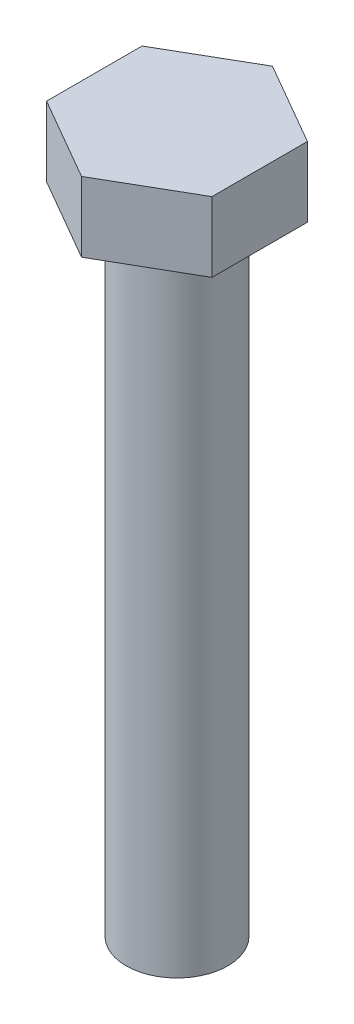
ISO-10303-21;
HEADER;
FILE_DESCRIPTION(('STEP AP214'),'2;1');
FILE_NAME('part.step','',(''),(''),'','','');
FILE_SCHEMA(('AUTOMOTIVE_DESIGN { 1 0 10303 214 1 1 1 1 }'));
ENDSEC;
DATA;
#1=APPLICATION_CONTEXT('core data for automotive mechanical design processes');
#2=APPLICATION_PROTOCOL_DEFINITION('international standard','automotive_design',2000,#1);
#3=PRODUCT_CONTEXT('',#1,'mechanical');
#4=PRODUCT('Part','Part','',(#3));
#5=PRODUCT_RELATED_PRODUCT_CATEGORY('part','',(#4));
#6=PRODUCT_DEFINITION_FORMATION('','',#4);
#7=PRODUCT_DEFINITION_CONTEXT('part definition',#1,'design');
#8=PRODUCT_DEFINITION('design','',#6,#7);
#9=PRODUCT_DEFINITION_SHAPE('','',#8);
#10=(LENGTH_UNIT() NAMED_UNIT(*) SI_UNIT(.MILLI.,.METRE.));
#11=(NAMED_UNIT(*) PLANE_ANGLE_UNIT() SI_UNIT($,.RADIAN.));
#12=(NAMED_UNIT(*) SI_UNIT($,.STERADIAN.) SOLID_ANGLE_UNIT());
#13=UNCERTAINTY_MEASURE_WITH_UNIT(LENGTH_MEASURE(1.E-05),#10,'distance_accuracy_value','');
#14=(GEOMETRIC_REPRESENTATION_CONTEXT(3) GLOBAL_UNCERTAINTY_ASSIGNED_CONTEXT((#13)) GLOBAL_UNIT_ASSIGNED_CONTEXT((#10,
#11,#12)) REPRESENTATION_CONTEXT('',''));
#15=CARTESIAN_POINT('',(0.,0.,0.));
#16=DIRECTION('',(0.,0.,1.));
#17=DIRECTION('',(1.,0.,0.));
#18=AXIS2_PLACEMENT_3D('',#15,#16,#17);
#19=CARTESIAN_POINT('',(6.5,5.5,3.75277674973257));
#20=DIRECTION('',(-1.,0.,0.));
#21=DIRECTION('',(0.,0.,1.));
#22=AXIS2_PLACEMENT_3D('',#19,#20,#21);
#23=PLANE('',#22);
#24=DIRECTION('',(0.,0.,-1.));
#25=VECTOR('',#24,1.);
#26=CARTESIAN_POINT('',(6.5,0.,3.75277674973257));
#27=LINE('',#26,#25);
#28=CARTESIAN_POINT('',(6.5,0.,3.75277674973257));
#29=VERTEX_POINT('',#28);
#30=CARTESIAN_POINT('',(6.5,0.,-3.75277674973257));
#31=VERTEX_POINT('',#30);
#32=EDGE_CURVE('E117',#29,#31,#27,.T.);
#33=ORIENTED_EDGE('',*,*,#32,.T.);
#34=DIRECTION('',(0.,-1.,0.));
#35=VECTOR('',#34,1.);
#36=CARTESIAN_POINT('',(6.5,5.5,-3.75277674973257));
#37=LINE('',#36,#35);
#38=CARTESIAN_POINT('',(6.5,5.5,-3.75277674973257));
#39=VERTEX_POINT('',#38);
#40=EDGE_CURVE('E11',#39,#31,#37,.T.);
#41=ORIENTED_EDGE('',*,*,#40,.F.);
#42=DIRECTION('',(0.,0.,-1.));
#43=VECTOR('',#42,1.);
#44=CARTESIAN_POINT('',(6.5,5.5,3.75277674973257));
#45=LINE('',#44,#43);
#46=CARTESIAN_POINT('',(6.5,5.5,3.75277674973257));
#47=VERTEX_POINT('',#46);
#48=EDGE_CURVE('E128',#47,#39,#45,.T.);
#49=ORIENTED_EDGE('',*,*,#48,.F.);
#50=DIRECTION('',(0.,-1.,0.));
#51=VECTOR('',#50,1.);
#52=CARTESIAN_POINT('',(6.5,5.5,3.75277674973257));
#53=LINE('',#52,#51);
#54=EDGE_CURVE('E113',#47,#29,#53,.T.);
#55=ORIENTED_EDGE('',*,*,#54,.T.);
#56=EDGE_LOOP('',(#33,#41,#49,#55));
#57=FACE_BOUND('',#56,.T.);
#58=ADVANCED_FACE('F33',(#57),#23,.F.);
#59=CARTESIAN_POINT('',(6.5,5.5,-3.75277674973257));
#60=DIRECTION('',(-0.5,0.,0.866025403784438));
#61=DIRECTION('',(0.866025403784439,0.,0.5));
#62=AXIS2_PLACEMENT_3D('',#59,#60,#61);
#63=PLANE('',#62);
#64=DIRECTION('',(-0.866025403784439,0.,-0.5));
#65=VECTOR('',#64,1.);
#66=CARTESIAN_POINT('',(6.5,0.,-3.75277674973257));
#67=LINE('',#66,#65);
#68=CARTESIAN_POINT('',(0.,0.,-7.50555349946514));
#69=VERTEX_POINT('',#68);
#70=EDGE_CURVE('E120',#31,#69,#67,.T.);
#71=ORIENTED_EDGE('',*,*,#70,.T.);
#72=DIRECTION('',(0.,-1.,0.));
#73=VECTOR('',#72,1.);
#74=CARTESIAN_POINT('',(0.,5.5,-7.50555349946514));
#75=LINE('',#74,#73);
#76=CARTESIAN_POINT('',(0.,5.5,-7.50555349946514));
#77=VERTEX_POINT('',#76);
#78=EDGE_CURVE('E41',#77,#69,#75,.T.);
#79=ORIENTED_EDGE('',*,*,#78,.F.);
#80=DIRECTION('',(-0.866025403784439,0.,-0.5));
#81=VECTOR('',#80,1.);
#82=CARTESIAN_POINT('',(6.5,5.5,-3.75277674973257));
#83=LINE('',#82,#81);
#84=EDGE_CURVE('E86',#39,#77,#83,.T.);
#85=ORIENTED_EDGE('',*,*,#84,.F.);
#86=ORIENTED_EDGE('',*,*,#40,.T.);
#87=EDGE_LOOP('',(#71,#79,#85,#86));
#88=FACE_BOUND('',#87,.T.);
#89=ADVANCED_FACE('F152',(#88),#63,.F.);
#90=CARTESIAN_POINT('',(0.,5.5,-7.50555349946514));
#91=DIRECTION('',(0.500000000000001,0.,0.866025403784438));
#92=DIRECTION('',(0.866025403784438,0.,-0.500000000000001));
#93=AXIS2_PLACEMENT_3D('',#90,#91,#92);
#94=PLANE('',#93);
#95=DIRECTION('',(-0.866025403784438,0.,0.5));
#96=VECTOR('',#95,1.);
#97=CARTESIAN_POINT('',(0.,0.,-7.50555349946514));
#98=LINE('',#97,#96);
#99=CARTESIAN_POINT('',(-6.5,0.,-3.75277674973257));
#100=VERTEX_POINT('',#99);
#101=EDGE_CURVE('E123',#69,#100,#98,.T.);
#102=ORIENTED_EDGE('',*,*,#101,.T.);
#103=DIRECTION('',(0.,-1.,0.));
#104=VECTOR('',#103,1.);
#105=CARTESIAN_POINT('',(-6.5,5.5,-3.75277674973257));
#106=LINE('',#105,#104);
#107=CARTESIAN_POINT('',(-6.5,5.5,-3.75277674973257));
#108=VERTEX_POINT('',#107);
#109=EDGE_CURVE('E108',#108,#100,#106,.T.);
#110=ORIENTED_EDGE('',*,*,#109,.F.);
#111=DIRECTION('',(-0.866025403784438,0.,0.5));
#112=VECTOR('',#111,1.);
#113=CARTESIAN_POINT('',(0.,5.5,-7.50555349946514));
#114=LINE('',#113,#112);
#115=EDGE_CURVE('E99',#77,#108,#114,.T.);
#116=ORIENTED_EDGE('',*,*,#115,.F.);
#117=ORIENTED_EDGE('',*,*,#78,.T.);
#118=EDGE_LOOP('',(#102,#110,#116,#117));
#119=FACE_BOUND('',#118,.T.);
#120=ADVANCED_FACE('F134',(#119),#94,.F.);
#121=CARTESIAN_POINT('',(-6.5,5.5,-3.75277674973257));
#122=DIRECTION('',(1.,0.,0.));
#123=DIRECTION('',(0.,0.,-1.));
#124=AXIS2_PLACEMENT_3D('',#121,#122,#123);
#125=PLANE('',#124);
#126=DIRECTION('',(0.,0.,1.));
#127=VECTOR('',#126,1.);
#128=CARTESIAN_POINT('',(-6.5,0.,-3.75277674973257));
#129=LINE('',#128,#127);
#130=CARTESIAN_POINT('',(-6.5,0.,3.75277674973257));
#131=VERTEX_POINT('',#130);
#132=EDGE_CURVE('E107',#100,#131,#129,.T.);
#133=ORIENTED_EDGE('',*,*,#132,.T.);
#134=DIRECTION('',(0.,-1.,0.));
#135=VECTOR('',#134,1.);
#136=CARTESIAN_POINT('',(-6.5,5.5,3.75277674973257));
#137=LINE('',#136,#135);
#138=CARTESIAN_POINT('',(-6.5,5.5,3.75277674973257));
#139=VERTEX_POINT('',#138);
#140=EDGE_CURVE('E104',#139,#131,#137,.T.);
#141=ORIENTED_EDGE('',*,*,#140,.F.);
#142=DIRECTION('',(0.,0.,1.));
#143=VECTOR('',#142,1.);
#144=CARTESIAN_POINT('',(-6.5,5.5,-3.75277674973257));
#145=LINE('',#144,#143);
#146=EDGE_CURVE('E93',#108,#139,#145,.T.);
#147=ORIENTED_EDGE('',*,*,#146,.F.);
#148=ORIENTED_EDGE('',*,*,#109,.T.);
#149=EDGE_LOOP('',(#133,#141,#147,#148));
#150=FACE_BOUND('',#149,.T.);
#151=ADVANCED_FACE('F105',(#150),#125,.F.);
#152=CARTESIAN_POINT('',(-6.5,5.5,3.75277674973257));
#153=DIRECTION('',(0.5,0.,-0.866025403784438));
#154=DIRECTION('',(-0.866025403784439,0.,-0.5));
#155=AXIS2_PLACEMENT_3D('',#152,#153,#154);
#156=PLANE('',#155);
#157=DIRECTION('',(0.866025403784439,0.,0.5));
#158=VECTOR('',#157,1.);
#159=CARTESIAN_POINT('',(-6.5,0.,3.75277674973257));
#160=LINE('',#159,#158);
#161=CARTESIAN_POINT('',(0.,0.,7.50555349946514));
#162=VERTEX_POINT('',#161);
#163=EDGE_CURVE('E72',#131,#162,#160,.T.);
#164=ORIENTED_EDGE('',*,*,#163,.T.);
#165=DIRECTION('',(0.,-1.,0.));
#166=VECTOR('',#165,1.);
#167=CARTESIAN_POINT('',(0.,5.5,7.50555349946514));
#168=LINE('',#167,#166);
#169=CARTESIAN_POINT('',(0.,5.5,7.50555349946514));
#170=VERTEX_POINT('',#169);
#171=EDGE_CURVE('E109',#170,#162,#168,.T.);
#172=ORIENTED_EDGE('',*,*,#171,.F.);
#173=DIRECTION('',(0.866025403784439,0.,0.5));
#174=VECTOR('',#173,1.);
#175=CARTESIAN_POINT('',(-6.5,5.5,3.75277674973257));
#176=LINE('',#175,#174);
#177=EDGE_CURVE('E97',#139,#170,#176,.T.);
#178=ORIENTED_EDGE('',*,*,#177,.F.);
#179=ORIENTED_EDGE('',*,*,#140,.T.);
#180=EDGE_LOOP('',(#164,#172,#178,#179));
#181=FACE_BOUND('',#180,.T.);
#182=ADVANCED_FACE('F111',(#181),#156,.F.);
#183=CARTESIAN_POINT('',(0.,5.5,7.50555349946514));
#184=DIRECTION('',(-0.5,0.,-0.866025403784438));
#185=DIRECTION('',(-0.866025403784438,0.,0.5));
#186=AXIS2_PLACEMENT_3D('',#183,#184,#185);
#187=PLANE('',#186);
#188=DIRECTION('',(0.866025403784438,0.,-0.5));
#189=VECTOR('',#188,1.);
#190=CARTESIAN_POINT('',(0.,0.,7.50555349946514));
#191=LINE('',#190,#189);
#192=EDGE_CURVE('E78',#162,#29,#191,.T.);
#193=ORIENTED_EDGE('',*,*,#192,.T.);
#194=ORIENTED_EDGE('',*,*,#54,.F.);
#195=DIRECTION('',(0.866025403784438,0.,-0.5));
#196=VECTOR('',#195,1.);
#197=CARTESIAN_POINT('',(0.,5.5,7.50555349946514));
#198=LINE('',#197,#196);
#199=EDGE_CURVE('E49',#170,#47,#198,.T.);
#200=ORIENTED_EDGE('',*,*,#199,.F.);
#201=ORIENTED_EDGE('',*,*,#171,.T.);
#202=EDGE_LOOP('',(#193,#194,#200,#201));
#203=FACE_BOUND('',#202,.T.);
#204=ADVANCED_FACE('F141',(#203),#187,.F.);
#205=CARTESIAN_POINT('',(0.,5.5,0.));
#206=DIRECTION('',(0.,1.,0.));
#207=DIRECTION('',(0.,0.,1.));
#208=AXIS2_PLACEMENT_3D('',#205,#206,#207);
#209=PLANE('',#208);
#210=ORIENTED_EDGE('',*,*,#48,.T.);
#211=ORIENTED_EDGE('',*,*,#84,.T.);
#212=ORIENTED_EDGE('',*,*,#115,.T.);
#213=ORIENTED_EDGE('',*,*,#146,.T.);
#214=ORIENTED_EDGE('',*,*,#177,.T.);
#215=ORIENTED_EDGE('',*,*,#199,.T.);
#216=EDGE_LOOP('',(#210,#211,#212,#213,#214,#215));
#217=FACE_BOUND('',#216,.T.);
#218=ADVANCED_FACE('F95',(#217),#209,.T.);
#219=CARTESIAN_POINT('',(0.,0.,0.));
#220=DIRECTION('',(0.,1.,0.));
#221=DIRECTION('',(0.,0.,1.));
#222=AXIS2_PLACEMENT_3D('',#219,#220,#221);
#223=PLANE('',#222);
#224=CARTESIAN_POINT('',(0.,0.,0.));
#225=DIRECTION('',(0.,1.,0.));
#226=DIRECTION('',(0.,0.,1.));
#227=AXIS2_PLACEMENT_3D('',#224,#225,#226);
#228=CIRCLE('',#227,4.);
#229=CARTESIAN_POINT('',(0.,0.,4.));
#230=VERTEX_POINT('',#229);
#231=EDGE_CURVE('E214',#230,#230,#228,.T.);
#232=ORIENTED_EDGE('',*,*,#231,.T.);
#233=EDGE_LOOP('',(#232));
#234=FACE_BOUND('',#233,.T.);
#235=ORIENTED_EDGE('',*,*,#32,.F.);
#236=ORIENTED_EDGE('',*,*,#192,.F.);
#237=ORIENTED_EDGE('',*,*,#163,.F.);
#238=ORIENTED_EDGE('',*,*,#132,.F.);
#239=ORIENTED_EDGE('',*,*,#101,.F.);
#240=ORIENTED_EDGE('',*,*,#70,.F.);
#241=EDGE_LOOP('',(#235,#236,#237,#238,#239,#240));
#242=FACE_BOUND('',#241,.T.);
#243=ADVANCED_FACE('F137',(#234,#242),#223,.F.);
#244=CARTESIAN_POINT('',(0.,-50.,0.));
#245=DIRECTION('',(0.,1.,0.));
#246=DIRECTION('',(0.,0.,1.));
#247=AXIS2_PLACEMENT_3D('',#244,#245,#246);
#248=CYLINDRICAL_SURFACE('',#247,4.);
#249=CARTESIAN_POINT('',(0.,-50.,0.));
#250=DIRECTION('',(0.,1.,0.));
#251=DIRECTION('',(0.,0.,1.));
#252=AXIS2_PLACEMENT_3D('',#249,#250,#251);
#253=CIRCLE('',#252,4.);
#254=CARTESIAN_POINT('',(0.,-50.,4.));
#255=VERTEX_POINT('',#254);
#256=EDGE_CURVE('E121',#255,#255,#253,.T.);
#257=ORIENTED_EDGE('',*,*,#256,.T.);
#258=EDGE_LOOP('',(#257));
#259=FACE_BOUND('',#258,.T.);
#260=ORIENTED_EDGE('',*,*,#231,.F.);
#261=EDGE_LOOP('',(#260));
#262=FACE_BOUND('',#261,.T.);
#263=ADVANCED_FACE('F189',(#259,#262),#248,.T.);
#264=CARTESIAN_POINT('',(0.,-50.,0.));
#265=DIRECTION('',(0.,1.,0.));
#266=DIRECTION('',(0.,0.,1.));
#267=AXIS2_PLACEMENT_3D('',#264,#265,#266);
#268=PLANE('',#267);
#269=ORIENTED_EDGE('',*,*,#256,.F.);
#270=EDGE_LOOP('',(#269));
#271=FACE_BOUND('',#270,.T.);
#272=ADVANCED_FACE('F198',(#271),#268,.F.);
#273=CLOSED_SHELL('',(#58,#89,#120,#151,#182,#204,#218,#243,#263,#272));
#274=MANIFOLD_SOLID_BREP('B2',#273);
#275=ADVANCED_BREP_SHAPE_REPRESENTATION('',(#18,#274),#14);
#276=SHAPE_DEFINITION_REPRESENTATION(#9,#275);
ENDSEC;
END-ISO-10303-21;
